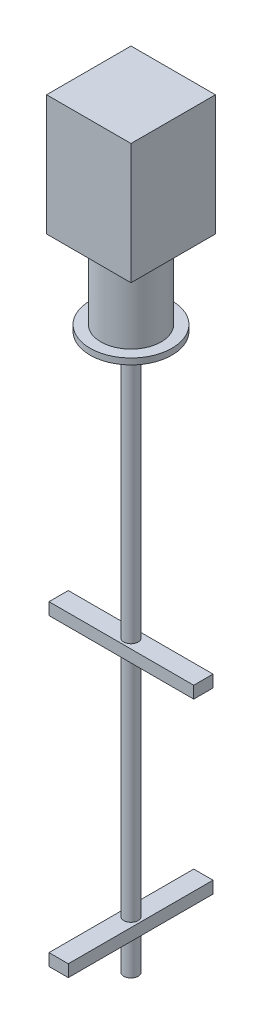
ISO-10303-21;
HEADER;
FILE_DESCRIPTION(('STEP AP214'),'2;1');
FILE_NAME('part.step','',(''),(''),'','','');
FILE_SCHEMA(('AUTOMOTIVE_DESIGN { 1 0 10303 214 1 1 1 1 }'));
ENDSEC;
DATA;
#1=APPLICATION_CONTEXT('core data for automotive mechanical design processes');
#2=APPLICATION_PROTOCOL_DEFINITION('international standard','automotive_design',2000,#1);
#3=PRODUCT_CONTEXT('',#1,'mechanical');
#4=PRODUCT('Part','Part','',(#3));
#5=PRODUCT_RELATED_PRODUCT_CATEGORY('part','',(#4));
#6=PRODUCT_DEFINITION_FORMATION('','',#4);
#7=PRODUCT_DEFINITION_CONTEXT('part definition',#1,'design');
#8=PRODUCT_DEFINITION('design','',#6,#7);
#9=PRODUCT_DEFINITION_SHAPE('','',#8);
#10=(LENGTH_UNIT() NAMED_UNIT(*) SI_UNIT(.MILLI.,.METRE.));
#11=(NAMED_UNIT(*) PLANE_ANGLE_UNIT() SI_UNIT($,.RADIAN.));
#12=(NAMED_UNIT(*) SI_UNIT($,.STERADIAN.) SOLID_ANGLE_UNIT());
#13=UNCERTAINTY_MEASURE_WITH_UNIT(LENGTH_MEASURE(1.E-05),#10,'distance_accuracy_value','');
#14=(GEOMETRIC_REPRESENTATION_CONTEXT(3) GLOBAL_UNCERTAINTY_ASSIGNED_CONTEXT((#13)) GLOBAL_UNIT_ASSIGNED_CONTEXT((#10,
#11,#12)) REPRESENTATION_CONTEXT('',''));
#15=CARTESIAN_POINT('',(0.,0.,0.));
#16=DIRECTION('',(0.,0.,1.));
#17=DIRECTION('',(1.,0.,0.));
#18=AXIS2_PLACEMENT_3D('',#15,#16,#17);
#19=CARTESIAN_POINT('',(0.,-2300.,0.));
#20=DIRECTION('',(0.,1.,0.));
#21=DIRECTION('',(0.,0.,1.));
#22=AXIS2_PLACEMENT_3D('',#19,#20,#21);
#23=CYLINDRICAL_SURFACE('',#22,30.);
#24=CARTESIAN_POINT('',(0.,-1150.,0.));
#25=DIRECTION('',(0.,-1.,0.));
#26=DIRECTION('',(0.,0.,-1.));
#27=AXIS2_PLACEMENT_3D('',#24,#25,#26);
#28=CIRCLE('',#27,30.);
#29=CARTESIAN_POINT('',(0.,-1150.,-30.));
#30=VERTEX_POINT('',#29);
#31=EDGE_CURVE('E58',#30,#30,#28,.F.);
#32=ORIENTED_EDGE('',*,*,#31,.F.);
#33=EDGE_LOOP('',(#32));
#34=FACE_BOUND('',#33,.T.);
#35=CARTESIAN_POINT('',(0.,-2100.,0.));
#36=DIRECTION('',(0.,-1.,0.));
#37=DIRECTION('',(0.,0.,-1.));
#38=AXIS2_PLACEMENT_3D('',#35,#36,#37);
#39=CIRCLE('',#38,30.);
#40=CARTESIAN_POINT('',(0.,-2100.,-30.));
#41=VERTEX_POINT('',#40);
#42=EDGE_CURVE('E163',#41,#41,#39,.F.);
#43=ORIENTED_EDGE('',*,*,#42,.T.);
#44=EDGE_LOOP('',(#43));
#45=FACE_BOUND('',#44,.T.);
#46=ADVANCED_FACE('F49',(#34,#45),#23,.T.);
#47=CARTESIAN_POINT('',(-300.,-1150.,40.));
#48=DIRECTION('',(-1.,0.,0.));
#49=DIRECTION('',(0.,0.,1.));
#50=AXIS2_PLACEMENT_3D('',#47,#48,#49);
#51=PLANE('',#50);
#52=DIRECTION('',(0.,0.,1.));
#53=VECTOR('',#52,1.);
#54=CARTESIAN_POINT('',(-300.,-1100.,40.));
#55=LINE('',#54,#53);
#56=CARTESIAN_POINT('',(-300.,-1100.,-40.));
#57=VERTEX_POINT('',#56);
#58=CARTESIAN_POINT('',(-300.,-1100.,40.));
#59=VERTEX_POINT('',#58);
#60=EDGE_CURVE('E176',#57,#59,#55,.T.);
#61=ORIENTED_EDGE('',*,*,#60,.F.);
#62=DIRECTION('',(0.,1.,0.));
#63=VECTOR('',#62,1.);
#64=CARTESIAN_POINT('',(-300.,-1150.,-40.));
#65=LINE('',#64,#63);
#66=CARTESIAN_POINT('',(-300.,-1150.,-40.));
#67=VERTEX_POINT('',#66);
#68=EDGE_CURVE('E66',#67,#57,#65,.T.);
#69=ORIENTED_EDGE('',*,*,#68,.F.);
#70=DIRECTION('',(0.,0.,1.));
#71=VECTOR('',#70,1.);
#72=CARTESIAN_POINT('',(-300.,-1150.,40.));
#73=LINE('',#72,#71);
#74=CARTESIAN_POINT('',(-300.,-1150.,40.));
#75=VERTEX_POINT('',#74);
#76=EDGE_CURVE('E167',#67,#75,#73,.T.);
#77=ORIENTED_EDGE('',*,*,#76,.T.);
#78=DIRECTION('',(0.,1.,0.));
#79=VECTOR('',#78,1.);
#80=CARTESIAN_POINT('',(-300.,-1150.,40.));
#81=LINE('',#80,#79);
#82=EDGE_CURVE('E95',#75,#59,#81,.T.);
#83=ORIENTED_EDGE('',*,*,#82,.T.);
#84=EDGE_LOOP('',(#61,#69,#77,#83));
#85=FACE_BOUND('',#84,.T.);
#86=ADVANCED_FACE('F225',(#85),#51,.T.);
#87=CARTESIAN_POINT('',(-300.,-1150.,-40.));
#88=DIRECTION('',(0.,0.,-1.));
#89=DIRECTION('',(-1.,0.,0.));
#90=AXIS2_PLACEMENT_3D('',#87,#88,#89);
#91=PLANE('',#90);
#92=DIRECTION('',(-1.,0.,0.));
#93=VECTOR('',#92,1.);
#94=CARTESIAN_POINT('',(-300.,-1100.,-40.));
#95=LINE('',#94,#93);
#96=CARTESIAN_POINT('',(300.,-1100.,-40.));
#97=VERTEX_POINT('',#96);
#98=EDGE_CURVE('E170',#97,#57,#95,.T.);
#99=ORIENTED_EDGE('',*,*,#98,.F.);
#100=DIRECTION('',(0.,1.,0.));
#101=VECTOR('',#100,1.);
#102=CARTESIAN_POINT('',(300.,-1150.,-40.));
#103=LINE('',#102,#101);
#104=CARTESIAN_POINT('',(300.,-1150.,-40.));
#105=VERTEX_POINT('',#104);
#106=EDGE_CURVE('E84',#105,#97,#103,.T.);
#107=ORIENTED_EDGE('',*,*,#106,.F.);
#108=DIRECTION('',(-1.,0.,0.));
#109=VECTOR('',#108,1.);
#110=CARTESIAN_POINT('',(-300.,-1150.,-40.));
#111=LINE('',#110,#109);
#112=EDGE_CURVE('E174',#105,#67,#111,.T.);
#113=ORIENTED_EDGE('',*,*,#112,.T.);
#114=ORIENTED_EDGE('',*,*,#68,.T.);
#115=EDGE_LOOP('',(#99,#107,#113,#114));
#116=FACE_BOUND('',#115,.T.);
#117=ADVANCED_FACE('F233',(#116),#91,.T.);
#118=CARTESIAN_POINT('',(300.,-1150.,40.));
#119=DIRECTION('',(1.,0.,0.));
#120=DIRECTION('',(0.,0.,-1.));
#121=AXIS2_PLACEMENT_3D('',#118,#119,#120);
#122=PLANE('',#121);
#123=DIRECTION('',(0.,0.,-1.));
#124=VECTOR('',#123,1.);
#125=CARTESIAN_POINT('',(300.,-1100.,40.));
#126=LINE('',#125,#124);
#127=CARTESIAN_POINT('',(300.,-1100.,40.));
#128=VERTEX_POINT('',#127);
#129=EDGE_CURVE('E182',#128,#97,#126,.T.);
#130=ORIENTED_EDGE('',*,*,#129,.F.);
#131=DIRECTION('',(0.,1.,0.));
#132=VECTOR('',#131,1.);
#133=CARTESIAN_POINT('',(300.,-1150.,40.));
#134=LINE('',#133,#132);
#135=CARTESIAN_POINT('',(300.,-1150.,40.));
#136=VERTEX_POINT('',#135);
#137=EDGE_CURVE('E189',#136,#128,#134,.T.);
#138=ORIENTED_EDGE('',*,*,#137,.F.);
#139=DIRECTION('',(0.,0.,-1.));
#140=VECTOR('',#139,1.);
#141=CARTESIAN_POINT('',(300.,-1150.,40.));
#142=LINE('',#141,#140);
#143=EDGE_CURVE('E172',#136,#105,#142,.T.);
#144=ORIENTED_EDGE('',*,*,#143,.T.);
#145=ORIENTED_EDGE('',*,*,#106,.T.);
#146=EDGE_LOOP('',(#130,#138,#144,#145));
#147=FACE_BOUND('',#146,.T.);
#148=ADVANCED_FACE('F312',(#147),#122,.T.);
#149=CARTESIAN_POINT('',(-300.,-1150.,40.));
#150=DIRECTION('',(0.,0.,1.));
#151=DIRECTION('',(1.,0.,0.));
#152=AXIS2_PLACEMENT_3D('',#149,#150,#151);
#153=PLANE('',#152);
#154=DIRECTION('',(1.,0.,0.));
#155=VECTOR('',#154,1.);
#156=CARTESIAN_POINT('',(-300.,-1100.,40.));
#157=LINE('',#156,#155);
#158=EDGE_CURVE('E179',#59,#128,#157,.T.);
#159=ORIENTED_EDGE('',*,*,#158,.F.);
#160=ORIENTED_EDGE('',*,*,#82,.F.);
#161=DIRECTION('',(1.,0.,0.));
#162=VECTOR('',#161,1.);
#163=CARTESIAN_POINT('',(-300.,-1150.,40.));
#164=LINE('',#163,#162);
#165=EDGE_CURVE('E169',#75,#136,#164,.T.);
#166=ORIENTED_EDGE('',*,*,#165,.T.);
#167=ORIENTED_EDGE('',*,*,#137,.T.);
#168=EDGE_LOOP('',(#159,#160,#166,#167));
#169=FACE_BOUND('',#168,.T.);
#170=ADVANCED_FACE('F303',(#169),#153,.T.);
#171=CARTESIAN_POINT('',(0.,-1150.,0.));
#172=DIRECTION('',(0.,-1.,0.));
#173=DIRECTION('',(0.,0.,-1.));
#174=AXIS2_PLACEMENT_3D('',#171,#172,#173);
#175=PLANE('',#174);
#176=ORIENTED_EDGE('',*,*,#31,.T.);
#177=EDGE_LOOP('',(#176));
#178=FACE_BOUND('',#177,.T.);
#179=ORIENTED_EDGE('',*,*,#76,.F.);
#180=ORIENTED_EDGE('',*,*,#112,.F.);
#181=ORIENTED_EDGE('',*,*,#143,.F.);
#182=ORIENTED_EDGE('',*,*,#165,.F.);
#183=EDGE_LOOP('',(#179,#180,#181,#182));
#184=FACE_BOUND('',#183,.T.);
#185=ADVANCED_FACE('F294',(#178,#184),#175,.T.);
#186=CARTESIAN_POINT('',(0.,-1100.,0.));
#187=DIRECTION('',(0.,-1.,0.));
#188=DIRECTION('',(0.,0.,-1.));
#189=AXIS2_PLACEMENT_3D('',#186,#187,#188);
#190=PLANE('',#189);
#191=CARTESIAN_POINT('',(0.,-1100.,0.));
#192=DIRECTION('',(0.,-1.,0.));
#193=DIRECTION('',(0.,0.,-1.));
#194=AXIS2_PLACEMENT_3D('',#191,#192,#193);
#195=CIRCLE('',#194,30.);
#196=CARTESIAN_POINT('',(0.,-1100.,-30.));
#197=VERTEX_POINT('',#196);
#198=EDGE_CURVE('E187',#197,#197,#195,.F.);
#199=ORIENTED_EDGE('',*,*,#198,.F.);
#200=EDGE_LOOP('',(#199));
#201=FACE_BOUND('',#200,.T.);
#202=ORIENTED_EDGE('',*,*,#60,.T.);
#203=ORIENTED_EDGE('',*,*,#158,.T.);
#204=ORIENTED_EDGE('',*,*,#129,.T.);
#205=ORIENTED_EDGE('',*,*,#98,.T.);
#206=EDGE_LOOP('',(#202,#203,#204,#205));
#207=FACE_BOUND('',#206,.T.);
#208=ADVANCED_FACE('F290',(#201,#207),#190,.F.);
#209=CARTESIAN_POINT('',(0.,0.,0.));
#210=DIRECTION('',(0.,1.,0.));
#211=DIRECTION('',(0.,0.,1.));
#212=AXIS2_PLACEMENT_3D('',#209,#210,#211);
#213=PLANE('',#212);
#214=CARTESIAN_POINT('',(0.,0.,0.));
#215=DIRECTION('',(0.,1.,0.));
#216=DIRECTION('',(0.,0.,1.));
#217=AXIS2_PLACEMENT_3D('',#214,#215,#216);
#218=CIRCLE('',#217,30.);
#219=CARTESIAN_POINT('',(0.,0.,30.));
#220=VERTEX_POINT('',#219);
#221=EDGE_CURVE('E195',#220,#220,#218,.T.);
#222=ORIENTED_EDGE('',*,*,#221,.T.);
#223=EDGE_LOOP('',(#222));
#224=FACE_BOUND('',#223,.T.);
#225=ADVANCED_FACE('F236',(#224),#213,.T.);
#226=ORIENTED_EDGE('',*,*,#221,.F.);
#227=EDGE_LOOP('',(#226));
#228=FACE_BOUND('',#227,.T.);
#229=ORIENTED_EDGE('',*,*,#198,.T.);
#230=EDGE_LOOP('',(#229));
#231=FACE_BOUND('',#230,.T.);
#232=ADVANCED_FACE('F227',(#228,#231),#23,.T.);
#233=CARTESIAN_POINT('',(-40.,-2150.,300.));
#234=DIRECTION('',(-1.,0.,0.));
#235=DIRECTION('',(0.,0.,1.));
#236=AXIS2_PLACEMENT_3D('',#233,#234,#235);
#237=PLANE('',#236);
#238=DIRECTION('',(0.,0.,1.));
#239=VECTOR('',#238,1.);
#240=CARTESIAN_POINT('',(-40.,-2100.,300.));
#241=LINE('',#240,#239);
#242=CARTESIAN_POINT('',(-40.,-2100.,-300.));
#243=VERTEX_POINT('',#242);
#244=CARTESIAN_POINT('',(-40.,-2100.,300.));
#245=VERTEX_POINT('',#244);
#246=EDGE_CURVE('E157',#243,#245,#241,.T.);
#247=ORIENTED_EDGE('',*,*,#246,.F.);
#248=DIRECTION('',(0.,1.,0.));
#249=VECTOR('',#248,1.);
#250=CARTESIAN_POINT('',(-40.,-2150.,-300.));
#251=LINE('',#250,#249);
#252=CARTESIAN_POINT('',(-40.,-2150.,-300.));
#253=VERTEX_POINT('',#252);
#254=EDGE_CURVE('E148',#253,#243,#251,.T.);
#255=ORIENTED_EDGE('',*,*,#254,.F.);
#256=DIRECTION('',(0.,0.,1.));
#257=VECTOR('',#256,1.);
#258=CARTESIAN_POINT('',(-40.,-2150.,300.));
#259=LINE('',#258,#257);
#260=CARTESIAN_POINT('',(-40.,-2150.,300.));
#261=VERTEX_POINT('',#260);
#262=EDGE_CURVE('E142',#253,#261,#259,.T.);
#263=ORIENTED_EDGE('',*,*,#262,.T.);
#264=DIRECTION('',(0.,1.,0.));
#265=VECTOR('',#264,1.);
#266=CARTESIAN_POINT('',(-40.,-2150.,300.));
#267=LINE('',#266,#265);
#268=EDGE_CURVE('E124',#261,#245,#267,.T.);
#269=ORIENTED_EDGE('',*,*,#268,.T.);
#270=EDGE_LOOP('',(#247,#255,#263,#269));
#271=FACE_BOUND('',#270,.T.);
#272=ADVANCED_FACE('F147',(#271),#237,.T.);
#273=CARTESIAN_POINT('',(-40.,-2150.,-300.));
#274=DIRECTION('',(0.,0.,-1.));
#275=DIRECTION('',(-1.,0.,0.));
#276=AXIS2_PLACEMENT_3D('',#273,#274,#275);
#277=PLANE('',#276);
#278=DIRECTION('',(-1.,0.,0.));
#279=VECTOR('',#278,1.);
#280=CARTESIAN_POINT('',(-40.,-2100.,-300.));
#281=LINE('',#280,#279);
#282=CARTESIAN_POINT('',(40.,-2100.,-300.));
#283=VERTEX_POINT('',#282);
#284=EDGE_CURVE('E149',#283,#243,#281,.T.);
#285=ORIENTED_EDGE('',*,*,#284,.F.);
#286=DIRECTION('',(0.,1.,0.));
#287=VECTOR('',#286,1.);
#288=CARTESIAN_POINT('',(40.,-2150.,-300.));
#289=LINE('',#288,#287);
#290=CARTESIAN_POINT('',(40.,-2150.,-300.));
#291=VERTEX_POINT('',#290);
#292=EDGE_CURVE('E164',#291,#283,#289,.T.);
#293=ORIENTED_EDGE('',*,*,#292,.F.);
#294=DIRECTION('',(-1.,0.,0.));
#295=VECTOR('',#294,1.);
#296=CARTESIAN_POINT('',(-40.,-2150.,-300.));
#297=LINE('',#296,#295);
#298=EDGE_CURVE('E135',#291,#253,#297,.T.);
#299=ORIENTED_EDGE('',*,*,#298,.T.);
#300=ORIENTED_EDGE('',*,*,#254,.T.);
#301=EDGE_LOOP('',(#285,#293,#299,#300));
#302=FACE_BOUND('',#301,.T.);
#303=ADVANCED_FACE('F213',(#302),#277,.T.);
#304=CARTESIAN_POINT('',(40.,-2150.,300.));
#305=DIRECTION('',(1.,0.,0.));
#306=DIRECTION('',(0.,0.,-1.));
#307=AXIS2_PLACEMENT_3D('',#304,#305,#306);
#308=PLANE('',#307);
#309=DIRECTION('',(0.,0.,-1.));
#310=VECTOR('',#309,1.);
#311=CARTESIAN_POINT('',(40.,-2100.,300.));
#312=LINE('',#311,#310);
#313=CARTESIAN_POINT('',(40.,-2100.,300.));
#314=VERTEX_POINT('',#313);
#315=EDGE_CURVE('E152',#314,#283,#312,.T.);
#316=ORIENTED_EDGE('',*,*,#315,.F.);
#317=DIRECTION('',(0.,1.,0.));
#318=VECTOR('',#317,1.);
#319=CARTESIAN_POINT('',(40.,-2150.,300.));
#320=LINE('',#319,#318);
#321=CARTESIAN_POINT('',(40.,-2150.,300.));
#322=VERTEX_POINT('',#321);
#323=EDGE_CURVE('E134',#322,#314,#320,.T.);
#324=ORIENTED_EDGE('',*,*,#323,.F.);
#325=DIRECTION('',(0.,0.,-1.));
#326=VECTOR('',#325,1.);
#327=CARTESIAN_POINT('',(40.,-2150.,300.));
#328=LINE('',#327,#326);
#329=EDGE_CURVE('E145',#322,#291,#328,.T.);
#330=ORIENTED_EDGE('',*,*,#329,.T.);
#331=ORIENTED_EDGE('',*,*,#292,.T.);
#332=EDGE_LOOP('',(#316,#324,#330,#331));
#333=FACE_BOUND('',#332,.T.);
#334=ADVANCED_FACE('F215',(#333),#308,.T.);
#335=CARTESIAN_POINT('',(-40.,-2150.,300.));
#336=DIRECTION('',(0.,0.,1.));
#337=DIRECTION('',(1.,0.,0.));
#338=AXIS2_PLACEMENT_3D('',#335,#336,#337);
#339=PLANE('',#338);
#340=DIRECTION('',(1.,0.,0.));
#341=VECTOR('',#340,1.);
#342=CARTESIAN_POINT('',(-40.,-2100.,300.));
#343=LINE('',#342,#341);
#344=EDGE_CURVE('E129',#245,#314,#343,.T.);
#345=ORIENTED_EDGE('',*,*,#344,.F.);
#346=ORIENTED_EDGE('',*,*,#268,.F.);
#347=DIRECTION('',(1.,0.,0.));
#348=VECTOR('',#347,1.);
#349=CARTESIAN_POINT('',(-40.,-2150.,300.));
#350=LINE('',#349,#348);
#351=EDGE_CURVE('E127',#261,#322,#350,.T.);
#352=ORIENTED_EDGE('',*,*,#351,.T.);
#353=ORIENTED_EDGE('',*,*,#323,.T.);
#354=EDGE_LOOP('',(#345,#346,#352,#353));
#355=FACE_BOUND('',#354,.T.);
#356=ADVANCED_FACE('F126',(#355),#339,.T.);
#357=CARTESIAN_POINT('',(0.,-2150.,0.));
#358=DIRECTION('',(0.,-1.,0.));
#359=DIRECTION('',(0.,0.,-1.));
#360=AXIS2_PLACEMENT_3D('',#357,#358,#359);
#361=PLANE('',#360);
#362=CARTESIAN_POINT('',(0.,-2150.,0.));
#363=DIRECTION('',(0.,-1.,0.));
#364=DIRECTION('',(0.,0.,-1.));
#365=AXIS2_PLACEMENT_3D('',#362,#363,#364);
#366=CIRCLE('',#365,30.);
#367=CARTESIAN_POINT('',(0.,-2150.,-30.));
#368=VERTEX_POINT('',#367);
#369=EDGE_CURVE('E12',#368,#368,#366,.F.);
#370=ORIENTED_EDGE('',*,*,#369,.T.);
#371=EDGE_LOOP('',(#370));
#372=FACE_BOUND('',#371,.T.);
#373=ORIENTED_EDGE('',*,*,#262,.F.);
#374=ORIENTED_EDGE('',*,*,#298,.F.);
#375=ORIENTED_EDGE('',*,*,#329,.F.);
#376=ORIENTED_EDGE('',*,*,#351,.F.);
#377=EDGE_LOOP('',(#373,#374,#375,#376));
#378=FACE_BOUND('',#377,.T.);
#379=ADVANCED_FACE('F140',(#372,#378),#361,.T.);
#380=CARTESIAN_POINT('',(0.,-2100.,0.));
#381=DIRECTION('',(0.,-1.,0.));
#382=DIRECTION('',(0.,0.,-1.));
#383=AXIS2_PLACEMENT_3D('',#380,#381,#382);
#384=PLANE('',#383);
#385=ORIENTED_EDGE('',*,*,#42,.F.);
#386=EDGE_LOOP('',(#385));
#387=FACE_BOUND('',#386,.T.);
#388=ORIENTED_EDGE('',*,*,#246,.T.);
#389=ORIENTED_EDGE('',*,*,#344,.T.);
#390=ORIENTED_EDGE('',*,*,#315,.T.);
#391=ORIENTED_EDGE('',*,*,#284,.T.);
#392=EDGE_LOOP('',(#388,#389,#390,#391));
#393=FACE_BOUND('',#392,.T.);
#394=ADVANCED_FACE('F205',(#387,#393),#384,.F.);
#395=CARTESIAN_POINT('',(0.,-2300.,0.));
#396=DIRECTION('',(0.,1.,0.));
#397=DIRECTION('',(0.,0.,1.));
#398=AXIS2_PLACEMENT_3D('',#395,#396,#397);
#399=PLANE('',#398);
#400=CARTESIAN_POINT('',(0.,-2300.,0.));
#401=DIRECTION('',(0.,1.,0.));
#402=DIRECTION('',(0.,0.,1.));
#403=AXIS2_PLACEMENT_3D('',#400,#401,#402);
#404=CIRCLE('',#403,30.);
#405=CARTESIAN_POINT('',(0.,-2300.,30.));
#406=VERTEX_POINT('',#405);
#407=EDGE_CURVE('E192',#406,#406,#404,.T.);
#408=ORIENTED_EDGE('',*,*,#407,.F.);
#409=EDGE_LOOP('',(#408));
#410=FACE_BOUND('',#409,.T.);
#411=ADVANCED_FACE('F208',(#410),#399,.F.);
#412=ORIENTED_EDGE('',*,*,#369,.F.);
#413=EDGE_LOOP('',(#412));
#414=FACE_BOUND('',#413,.T.);
#415=ORIENTED_EDGE('',*,*,#407,.T.);
#416=EDGE_LOOP('',(#415));
#417=FACE_BOUND('',#416,.T.);
#418=ADVANCED_FACE('F51',(#414,#417),#23,.T.);
#419=CLOSED_SHELL('',(#46,#86,#117,#148,#170,#185,#208,#225,#232,#272,#303,#334,#356,#379,#394,
#411,#418));
#420=MANIFOLD_SOLID_BREP('B2',#419);
#421=CARTESIAN_POINT('',(0.,25.,0.));
#422=DIRECTION('',(0.,1.,0.));
#423=DIRECTION('',(0.,0.,1.));
#424=AXIS2_PLACEMENT_3D('',#421,#422,#423);
#425=PLANE('',#424);
#426=CARTESIAN_POINT('',(0.,25.,0.));
#427=DIRECTION('',(0.,1.,0.));
#428=DIRECTION('',(0.,0.,1.));
#429=AXIS2_PLACEMENT_3D('',#426,#427,#428);
#430=CIRCLE('',#429,125.);
#431=CARTESIAN_POINT('',(0.,25.,125.));
#432=VERTEX_POINT('',#431);
#433=EDGE_CURVE('E453',#432,#432,#430,.T.);
#434=ORIENTED_EDGE('',*,*,#433,.F.);
#435=EDGE_LOOP('',(#434));
#436=FACE_BOUND('',#435,.T.);
#437=CARTESIAN_POINT('',(0.,25.,0.));
#438=DIRECTION('',(0.,1.,0.));
#439=DIRECTION('',(0.,0.,1.));
#440=AXIS2_PLACEMENT_3D('',#437,#438,#439);
#441=CIRCLE('',#440,170.);
#442=CARTESIAN_POINT('',(0.,25.,170.));
#443=VERTEX_POINT('',#442);
#444=EDGE_CURVE('E47',#443,#443,#441,.T.);
#445=ORIENTED_EDGE('',*,*,#444,.T.);
#446=EDGE_LOOP('',(#445));
#447=FACE_BOUND('',#446,.T.);
#448=ADVANCED_FACE('F376',(#436,#447),#425,.T.);
#449=CARTESIAN_POINT('',(0.,0.,0.));
#450=DIRECTION('',(0.,1.,0.));
#451=DIRECTION('',(0.,0.,1.));
#452=AXIS2_PLACEMENT_3D('',#449,#450,#451);
#453=PLANE('',#452);
#454=CARTESIAN_POINT('',(0.,0.,0.));
#455=DIRECTION('',(0.,1.,0.));
#456=DIRECTION('',(0.,0.,1.));
#457=AXIS2_PLACEMENT_3D('',#454,#455,#456);
#458=CIRCLE('',#457,170.);
#459=CARTESIAN_POINT('',(0.,0.,170.));
#460=VERTEX_POINT('',#459);
#461=EDGE_CURVE('E380',#460,#460,#458,.T.);
#462=ORIENTED_EDGE('',*,*,#461,.F.);
#463=EDGE_LOOP('',(#462));
#464=FACE_BOUND('',#463,.T.);
#465=CARTESIAN_POINT('',(0.,0.,0.));
#466=DIRECTION('',(0.,1.,0.));
#467=DIRECTION('',(0.,0.,1.));
#468=AXIS2_PLACEMENT_3D('',#465,#466,#467);
#469=CIRCLE('',#468,100.);
#470=CARTESIAN_POINT('',(0.,0.,100.));
#471=VERTEX_POINT('',#470);
#472=EDGE_CURVE('E462',#471,#471,#469,.T.);
#473=ORIENTED_EDGE('',*,*,#472,.T.);
#474=EDGE_LOOP('',(#473));
#475=FACE_BOUND('',#474,.T.);
#476=ADVANCED_FACE('F470',(#464,#475),#453,.F.);
#477=CARTESIAN_POINT('',(0.,25.,0.));
#478=DIRECTION('',(0.,-1.,0.));
#479=DIRECTION('',(0.,0.,-1.));
#480=AXIS2_PLACEMENT_3D('',#477,#478,#479);
#481=CYLINDRICAL_SURFACE('',#480,170.);
#482=ORIENTED_EDGE('',*,*,#444,.F.);
#483=EDGE_LOOP('',(#482));
#484=FACE_BOUND('',#483,.T.);
#485=ORIENTED_EDGE('',*,*,#461,.T.);
#486=EDGE_LOOP('',(#485));
#487=FACE_BOUND('',#486,.T.);
#488=ADVANCED_FACE('F378',(#484,#487),#481,.T.);
#489=CARTESIAN_POINT('',(0.,25.,0.));
#490=DIRECTION('',(0.,-1.,0.));
#491=DIRECTION('',(0.,0.,-1.));
#492=AXIS2_PLACEMENT_3D('',#489,#490,#491);
#493=CYLINDRICAL_SURFACE('',#492,100.);
#494=CARTESIAN_POINT('',(0.,25.,0.));
#495=DIRECTION('',(0.,1.,0.));
#496=DIRECTION('',(0.,0.,1.));
#497=AXIS2_PLACEMENT_3D('',#494,#495,#496);
#498=CIRCLE('',#497,100.);
#499=CARTESIAN_POINT('',(0.,25.,100.));
#500=VERTEX_POINT('',#499);
#501=EDGE_CURVE('E457',#500,#500,#498,.T.);
#502=ORIENTED_EDGE('',*,*,#501,.T.);
#503=EDGE_LOOP('',(#502));
#504=FACE_BOUND('',#503,.T.);
#505=ORIENTED_EDGE('',*,*,#472,.F.);
#506=EDGE_LOOP('',(#505));
#507=FACE_BOUND('',#506,.T.);
#508=ADVANCED_FACE('F475',(#504,#507),#493,.F.);
#509=CARTESIAN_POINT('',(0.,25.,0.));
#510=DIRECTION('',(0.,1.,0.));
#511=DIRECTION('',(0.,0.,1.));
#512=AXIS2_PLACEMENT_3D('',#509,#510,#511);
#513=PLANE('',#512);
#514=ORIENTED_EDGE('',*,*,#501,.F.);
#515=EDGE_LOOP('',(#514));
#516=FACE_BOUND('',#515,.T.);
#517=ADVANCED_FACE('F483',(#516),#513,.F.);
#518=CARTESIAN_POINT('',(0.,350.,0.));
#519=DIRECTION('',(0.,-1.,0.));
#520=DIRECTION('',(0.,0.,-1.));
#521=AXIS2_PLACEMENT_3D('',#518,#519,#520);
#522=CYLINDRICAL_SURFACE('',#521,125.);
#523=CARTESIAN_POINT('',(0.,350.,0.));
#524=DIRECTION('',(0.,1.,0.));
#525=DIRECTION('',(0.,0.,1.));
#526=AXIS2_PLACEMENT_3D('',#523,#524,#525);
#527=CIRCLE('',#526,125.);
#528=CARTESIAN_POINT('',(0.,350.,125.));
#529=VERTEX_POINT('',#528);
#530=EDGE_CURVE('E454',#529,#529,#527,.T.);
#531=ORIENTED_EDGE('',*,*,#530,.F.);
#532=EDGE_LOOP('',(#531));
#533=FACE_BOUND('',#532,.T.);
#534=ORIENTED_EDGE('',*,*,#433,.T.);
#535=EDGE_LOOP('',(#534));
#536=FACE_BOUND('',#535,.T.);
#537=ADVANCED_FACE('F485',(#533,#536),#522,.T.);
#538=CARTESIAN_POINT('',(-175.,850.,175.));
#539=DIRECTION('',(1.,0.,0.));
#540=DIRECTION('',(0.,0.,-1.));
#541=AXIS2_PLACEMENT_3D('',#538,#539,#540);
#542=PLANE('',#541);
#543=DIRECTION('',(0.,0.,1.));
#544=VECTOR('',#543,1.);
#545=CARTESIAN_POINT('',(-175.,350.,175.));
#546=LINE('',#545,#544);
#547=CARTESIAN_POINT('',(-175.,350.,-175.));
#548=VERTEX_POINT('',#547);
#549=CARTESIAN_POINT('',(-175.,350.,175.));
#550=VERTEX_POINT('',#549);
#551=EDGE_CURVE('E444',#548,#550,#546,.T.);
#552=ORIENTED_EDGE('',*,*,#551,.T.);
#553=DIRECTION('',(0.,-1.,0.));
#554=VECTOR('',#553,1.);
#555=CARTESIAN_POINT('',(-175.,850.,175.));
#556=LINE('',#555,#554);
#557=CARTESIAN_POINT('',(-175.,850.,175.));
#558=VERTEX_POINT('',#557);
#559=EDGE_CURVE('E435',#558,#550,#556,.T.);
#560=ORIENTED_EDGE('',*,*,#559,.F.);
#561=DIRECTION('',(0.,0.,1.));
#562=VECTOR('',#561,1.);
#563=CARTESIAN_POINT('',(-175.,850.,175.));
#564=LINE('',#563,#562);
#565=CARTESIAN_POINT('',(-175.,850.,-175.));
#566=VERTEX_POINT('',#565);
#567=EDGE_CURVE('E429',#566,#558,#564,.T.);
#568=ORIENTED_EDGE('',*,*,#567,.F.);
#569=DIRECTION('',(0.,-1.,0.));
#570=VECTOR('',#569,1.);
#571=CARTESIAN_POINT('',(-175.,850.,-175.));
#572=LINE('',#571,#570);
#573=EDGE_CURVE('E440',#566,#548,#572,.T.);
#574=ORIENTED_EDGE('',*,*,#573,.T.);
#575=EDGE_LOOP('',(#552,#560,#568,#574));
#576=FACE_BOUND('',#575,.T.);
#577=ADVANCED_FACE('F488',(#576),#542,.F.);
#578=CARTESIAN_POINT('',(-175.,850.,175.));
#579=DIRECTION('',(0.,0.,-1.));
#580=DIRECTION('',(-1.,0.,0.));
#581=AXIS2_PLACEMENT_3D('',#578,#579,#580);
#582=PLANE('',#581);
#583=DIRECTION('',(1.,0.,0.));
#584=VECTOR('',#583,1.);
#585=CARTESIAN_POINT('',(-175.,350.,175.));
#586=LINE('',#585,#584);
#587=CARTESIAN_POINT('',(175.,350.,175.));
#588=VERTEX_POINT('',#587);
#589=EDGE_CURVE('E434',#550,#588,#586,.T.);
#590=ORIENTED_EDGE('',*,*,#589,.T.);
#591=DIRECTION('',(0.,-1.,0.));
#592=VECTOR('',#591,1.);
#593=CARTESIAN_POINT('',(175.,850.,175.));
#594=LINE('',#593,#592);
#595=CARTESIAN_POINT('',(175.,850.,175.));
#596=VERTEX_POINT('',#595);
#597=EDGE_CURVE('E432',#596,#588,#594,.T.);
#598=ORIENTED_EDGE('',*,*,#597,.F.);
#599=DIRECTION('',(1.,0.,0.));
#600=VECTOR('',#599,1.);
#601=CARTESIAN_POINT('',(-175.,850.,175.));
#602=LINE('',#601,#600);
#603=EDGE_CURVE('E424',#558,#596,#602,.T.);
#604=ORIENTED_EDGE('',*,*,#603,.F.);
#605=ORIENTED_EDGE('',*,*,#559,.T.);
#606=EDGE_LOOP('',(#590,#598,#604,#605));
#607=FACE_BOUND('',#606,.T.);
#608=ADVANCED_FACE('F433',(#607),#582,.F.);
#609=CARTESIAN_POINT('',(175.,850.,175.));
#610=DIRECTION('',(-1.,0.,0.));
#611=DIRECTION('',(0.,0.,1.));
#612=AXIS2_PLACEMENT_3D('',#609,#610,#611);
#613=PLANE('',#612);
#614=DIRECTION('',(0.,0.,-1.));
#615=VECTOR('',#614,1.);
#616=CARTESIAN_POINT('',(175.,350.,175.));
#617=LINE('',#616,#615);
#618=CARTESIAN_POINT('',(175.,350.,-175.));
#619=VERTEX_POINT('',#618);
#620=EDGE_CURVE('E410',#588,#619,#617,.T.);
#621=ORIENTED_EDGE('',*,*,#620,.T.);
#622=DIRECTION('',(0.,-1.,0.));
#623=VECTOR('',#622,1.);
#624=CARTESIAN_POINT('',(175.,850.,-175.));
#625=LINE('',#624,#623);
#626=CARTESIAN_POINT('',(175.,850.,-175.));
#627=VERTEX_POINT('',#626);
#628=EDGE_CURVE('E436',#627,#619,#625,.T.);
#629=ORIENTED_EDGE('',*,*,#628,.F.);
#630=DIRECTION('',(0.,0.,-1.));
#631=VECTOR('',#630,1.);
#632=CARTESIAN_POINT('',(175.,850.,175.));
#633=LINE('',#632,#631);
#634=EDGE_CURVE('E427',#596,#627,#633,.T.);
#635=ORIENTED_EDGE('',*,*,#634,.F.);
#636=ORIENTED_EDGE('',*,*,#597,.T.);
#637=EDGE_LOOP('',(#621,#629,#635,#636));
#638=FACE_BOUND('',#637,.T.);
#639=ADVANCED_FACE('F438',(#638),#613,.F.);
#640=CARTESIAN_POINT('',(-175.,850.,-175.));
#641=DIRECTION('',(0.,0.,1.));
#642=DIRECTION('',(1.,0.,0.));
#643=AXIS2_PLACEMENT_3D('',#640,#641,#642);
#644=PLANE('',#643);
#645=DIRECTION('',(-1.,0.,0.));
#646=VECTOR('',#645,1.);
#647=CARTESIAN_POINT('',(-175.,350.,-175.));
#648=LINE('',#647,#646);
#649=EDGE_CURVE('E416',#619,#548,#648,.T.);
#650=ORIENTED_EDGE('',*,*,#649,.T.);
#651=ORIENTED_EDGE('',*,*,#573,.F.);
#652=DIRECTION('',(-1.,0.,0.));
#653=VECTOR('',#652,1.);
#654=CARTESIAN_POINT('',(-175.,850.,-175.));
#655=LINE('',#654,#653);
#656=EDGE_CURVE('E393',#627,#566,#655,.T.);
#657=ORIENTED_EDGE('',*,*,#656,.F.);
#658=ORIENTED_EDGE('',*,*,#628,.T.);
#659=EDGE_LOOP('',(#650,#651,#657,#658));
#660=FACE_BOUND('',#659,.T.);
#661=ADVANCED_FACE('F500',(#660),#644,.F.);
#662=CARTESIAN_POINT('',(0.,850.,0.));
#663=DIRECTION('',(0.,-1.,0.));
#664=DIRECTION('',(0.,0.,-1.));
#665=AXIS2_PLACEMENT_3D('',#662,#663,#664);
#666=PLANE('',#665);
#667=ORIENTED_EDGE('',*,*,#567,.T.);
#668=ORIENTED_EDGE('',*,*,#603,.T.);
#669=ORIENTED_EDGE('',*,*,#634,.T.);
#670=ORIENTED_EDGE('',*,*,#656,.T.);
#671=EDGE_LOOP('',(#667,#668,#669,#670));
#672=FACE_BOUND('',#671,.T.);
#673=ADVANCED_FACE('F425',(#672),#666,.F.);
#674=CARTESIAN_POINT('',(0.,350.,0.));
#675=DIRECTION('',(0.,-1.,0.));
#676=DIRECTION('',(0.,0.,-1.));
#677=AXIS2_PLACEMENT_3D('',#674,#675,#676);
#678=PLANE('',#677);
#679=ORIENTED_EDGE('',*,*,#530,.T.);
#680=EDGE_LOOP('',(#679));
#681=FACE_BOUND('',#680,.T.);
#682=ORIENTED_EDGE('',*,*,#551,.F.);
#683=ORIENTED_EDGE('',*,*,#649,.F.);
#684=ORIENTED_EDGE('',*,*,#620,.F.);
#685=ORIENTED_EDGE('',*,*,#589,.F.);
#686=EDGE_LOOP('',(#682,#683,#684,#685));
#687=FACE_BOUND('',#686,.T.);
#688=ADVANCED_FACE('F503',(#681,#687),#678,.T.);
#689=CLOSED_SHELL('',(#448,#476,#488,#508,#517,#537,#577,#608,#639,#661,#673,#688));
#690=MANIFOLD_SOLID_BREP('B6',#689);
#691=ADVANCED_BREP_SHAPE_REPRESENTATION('',(#18,#420,#690),#14);
#692=SHAPE_DEFINITION_REPRESENTATION(#9,#691);
ENDSEC;
END-ISO-10303-21;
